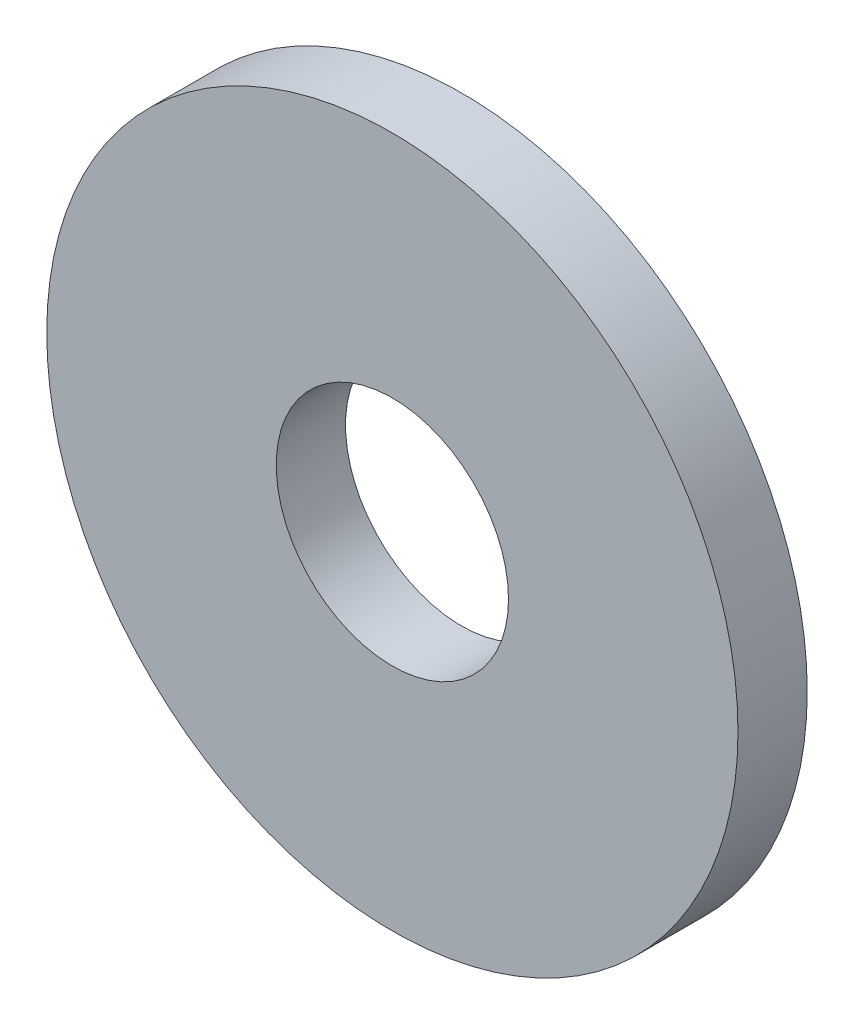
ISO-10303-21;
HEADER;
FILE_DESCRIPTION(('STEP AP214'),'2;1');
FILE_NAME('part.step','',(''),(''),'','','');
FILE_SCHEMA(('AUTOMOTIVE_DESIGN { 1 0 10303 214 1 1 1 1 }'));
ENDSEC;
DATA;
#1=APPLICATION_CONTEXT('core data for automotive mechanical design processes');
#2=APPLICATION_PROTOCOL_DEFINITION('international standard','automotive_design',2000,#1);
#3=PRODUCT_CONTEXT('',#1,'mechanical');
#4=PRODUCT('Part','Part','',(#3));
#5=PRODUCT_RELATED_PRODUCT_CATEGORY('part','',(#4));
#6=PRODUCT_DEFINITION_FORMATION('','',#4);
#7=PRODUCT_DEFINITION_CONTEXT('part definition',#1,'design');
#8=PRODUCT_DEFINITION('design','',#6,#7);
#9=PRODUCT_DEFINITION_SHAPE('','',#8);
#10=(LENGTH_UNIT() NAMED_UNIT(*) SI_UNIT(.MILLI.,.METRE.));
#11=(NAMED_UNIT(*) PLANE_ANGLE_UNIT() SI_UNIT($,.RADIAN.));
#12=(NAMED_UNIT(*) SI_UNIT($,.STERADIAN.) SOLID_ANGLE_UNIT());
#13=UNCERTAINTY_MEASURE_WITH_UNIT(LENGTH_MEASURE(1.E-05),#10,'distance_accuracy_value','');
#14=(GEOMETRIC_REPRESENTATION_CONTEXT(3) GLOBAL_UNCERTAINTY_ASSIGNED_CONTEXT((#13)) GLOBAL_UNIT_ASSIGNED_CONTEXT((#10,
#11,#12)) REPRESENTATION_CONTEXT('',''));
#15=CARTESIAN_POINT('',(0.,0.,0.));
#16=DIRECTION('',(0.,0.,1.));
#17=DIRECTION('',(1.,0.,0.));
#18=AXIS2_PLACEMENT_3D('',#15,#16,#17);
#19=CARTESIAN_POINT('',(0.,0.,3.));
#20=DIRECTION('',(0.,0.,1.));
#21=DIRECTION('',(1.,0.,0.));
#22=AXIS2_PLACEMENT_3D('',#19,#20,#21);
#23=PLANE('',#22);
#24=CARTESIAN_POINT('',(0.,0.,3.));
#25=DIRECTION('',(0.,0.,1.));
#26=DIRECTION('',(1.,0.,0.));
#27=AXIS2_PLACEMENT_3D('',#24,#25,#26);
#28=CIRCLE('',#27,14.97);
#29=CARTESIAN_POINT('',(14.97,0.,3.));
#30=VERTEX_POINT('',#29);
#31=EDGE_CURVE('E10',#30,#30,#28,.T.);
#32=ORIENTED_EDGE('',*,*,#31,.T.);
#33=EDGE_LOOP('',(#32));
#34=FACE_BOUND('',#33,.T.);
#35=CARTESIAN_POINT('',(0.,0.,3.));
#36=DIRECTION('',(0.,0.,1.));
#37=DIRECTION('',(1.,0.,0.));
#38=AXIS2_PLACEMENT_3D('',#35,#36,#37);
#39=CIRCLE('',#38,5.03);
#40=CARTESIAN_POINT('',(5.03,0.,3.));
#41=VERTEX_POINT('',#40);
#42=EDGE_CURVE('E43',#41,#41,#39,.T.);
#43=ORIENTED_EDGE('',*,*,#42,.F.);
#44=EDGE_LOOP('',(#43));
#45=FACE_BOUND('',#44,.T.);
#46=ADVANCED_FACE('F32',(#34,#45),#23,.T.);
#47=CARTESIAN_POINT('',(0.,0.,0.));
#48=DIRECTION('',(0.,0.,1.));
#49=DIRECTION('',(1.,0.,0.));
#50=AXIS2_PLACEMENT_3D('',#47,#48,#49);
#51=PLANE('',#50);
#52=CARTESIAN_POINT('',(0.,0.,0.));
#53=DIRECTION('',(0.,0.,1.));
#54=DIRECTION('',(1.,0.,0.));
#55=AXIS2_PLACEMENT_3D('',#52,#53,#54);
#56=CIRCLE('',#55,14.97);
#57=CARTESIAN_POINT('',(14.97,0.,0.));
#58=VERTEX_POINT('',#57);
#59=EDGE_CURVE('E36',#58,#58,#56,.T.);
#60=ORIENTED_EDGE('',*,*,#59,.F.);
#61=EDGE_LOOP('',(#60));
#62=FACE_BOUND('',#61,.T.);
#63=CARTESIAN_POINT('',(0.,0.,0.));
#64=DIRECTION('',(0.,0.,1.));
#65=DIRECTION('',(1.,0.,0.));
#66=AXIS2_PLACEMENT_3D('',#63,#64,#65);
#67=CIRCLE('',#66,5.03);
#68=CARTESIAN_POINT('',(5.03,0.,0.));
#69=VERTEX_POINT('',#68);
#70=EDGE_CURVE('E45',#69,#69,#67,.T.);
#71=ORIENTED_EDGE('',*,*,#70,.T.);
#72=EDGE_LOOP('',(#71));
#73=FACE_BOUND('',#72,.T.);
#74=ADVANCED_FACE('F55',(#62,#73),#51,.F.);
#75=CARTESIAN_POINT('',(0.,0.,3.));
#76=DIRECTION('',(0.,0.,-1.));
#77=DIRECTION('',(-1.,0.,0.));
#78=AXIS2_PLACEMENT_3D('',#75,#76,#77);
#79=CYLINDRICAL_SURFACE('',#78,14.97);
#80=ORIENTED_EDGE('',*,*,#31,.F.);
#81=EDGE_LOOP('',(#80));
#82=FACE_BOUND('',#81,.T.);
#83=ORIENTED_EDGE('',*,*,#59,.T.);
#84=EDGE_LOOP('',(#83));
#85=FACE_BOUND('',#84,.T.);
#86=ADVANCED_FACE('F34',(#82,#85),#79,.T.);
#87=CARTESIAN_POINT('',(0.,0.,3.));
#88=DIRECTION('',(0.,0.,-1.));
#89=DIRECTION('',(-1.,0.,0.));
#90=AXIS2_PLACEMENT_3D('',#87,#88,#89);
#91=CYLINDRICAL_SURFACE('',#90,5.03);
#92=ORIENTED_EDGE('',*,*,#42,.T.);
#93=EDGE_LOOP('',(#92));
#94=FACE_BOUND('',#93,.T.);
#95=ORIENTED_EDGE('',*,*,#70,.F.);
#96=EDGE_LOOP('',(#95));
#97=FACE_BOUND('',#96,.T.);
#98=ADVANCED_FACE('F51',(#94,#97),#91,.F.);
#99=CLOSED_SHELL('',(#46,#74,#86,#98));
#100=MANIFOLD_SOLID_BREP('B2',#99);
#101=ADVANCED_BREP_SHAPE_REPRESENTATION('',(#18,#100),#14);
#102=SHAPE_DEFINITION_REPRESENTATION(#9,#101);
ENDSEC;
END-ISO-10303-21;
